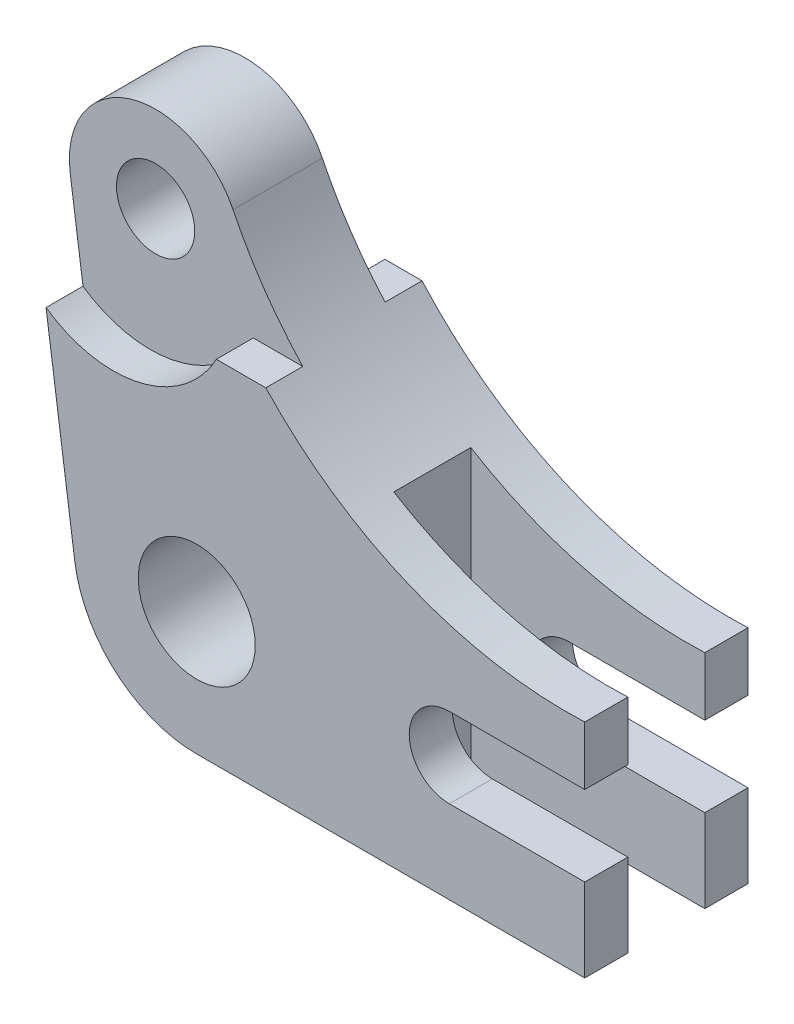
ISO-10303-21;
HEADER;
FILE_DESCRIPTION(('STEP AP214'),'2;1');
FILE_NAME('part.step','',(''),(''),'','','');
FILE_SCHEMA(('AUTOMOTIVE_DESIGN { 1 0 10303 214 1 1 1 1 }'));
ENDSEC;
DATA;
#1=APPLICATION_CONTEXT('core data for automotive mechanical design processes');
#2=APPLICATION_PROTOCOL_DEFINITION('international standard','automotive_design',2000,#1);
#3=PRODUCT_CONTEXT('',#1,'mechanical');
#4=PRODUCT('Part','Part','',(#3));
#5=PRODUCT_RELATED_PRODUCT_CATEGORY('part','',(#4));
#6=PRODUCT_DEFINITION_FORMATION('','',#4);
#7=PRODUCT_DEFINITION_CONTEXT('part definition',#1,'design');
#8=PRODUCT_DEFINITION('design','',#6,#7);
#9=PRODUCT_DEFINITION_SHAPE('','',#8);
#10=(LENGTH_UNIT() NAMED_UNIT(*) SI_UNIT(.MILLI.,.METRE.));
#11=(NAMED_UNIT(*) PLANE_ANGLE_UNIT() SI_UNIT($,.RADIAN.));
#12=(NAMED_UNIT(*) SI_UNIT($,.STERADIAN.) SOLID_ANGLE_UNIT());
#13=UNCERTAINTY_MEASURE_WITH_UNIT(LENGTH_MEASURE(1.E-05),#10,'distance_accuracy_value','');
#14=(GEOMETRIC_REPRESENTATION_CONTEXT(3) GLOBAL_UNCERTAINTY_ASSIGNED_CONTEXT((#13)) GLOBAL_UNIT_ASSIGNED_CONTEXT((#10,
#11,#12)) REPRESENTATION_CONTEXT('',''));
#15=CARTESIAN_POINT('',(0.,0.,0.));
#16=DIRECTION('',(0.,0.,1.));
#17=DIRECTION('',(1.,0.,0.));
#18=AXIS2_PLACEMENT_3D('',#15,#16,#17);
#19=CARTESIAN_POINT('',(-12.6821332100236,47.3303654881643,26.5));
#20=DIRECTION('',(0.,0.,-1.));
#21=DIRECTION('',(-1.,0.,0.));
#22=AXIS2_PLACEMENT_3D('',#19,#20,#21);
#23=CYLINDRICAL_SURFACE('',#22,14.);
#24=CARTESIAN_POINT('',(-12.6821332100236,47.3303654881643,6.));
#25=DIRECTION('',(0.,0.,-1.));
#26=DIRECTION('',(-1.,0.,0.));
#27=AXIS2_PLACEMENT_3D('',#24,#25,#26);
#28=CIRCLE('',#27,14.);
#29=CARTESIAN_POINT('',(-26.5470217071029,45.3900389786416,6.));
#30=VERTEX_POINT('',#29);
#31=CARTESIAN_POINT('',(-0.107256867772479,53.4844279656741,6.));
#32=VERTEX_POINT('',#31);
#33=EDGE_CURVE('E231',#30,#32,#28,.T.);
#34=ORIENTED_EDGE('',*,*,#33,.F.);
#35=DIRECTION('',(0.,0.,-1.));
#36=VECTOR('',#35,1.);
#37=CARTESIAN_POINT('',(-26.5470217071029,45.3900389786416,26.5));
#38=LINE('',#37,#36);
#39=CARTESIAN_POINT('',(-26.5470217071029,45.3900389786416,20.5));
#40=VERTEX_POINT('',#39);
#41=EDGE_CURVE('E386',#40,#30,#38,.T.);
#42=ORIENTED_EDGE('',*,*,#41,.F.);
#43=CARTESIAN_POINT('',(-12.6821332100236,47.3303654881643,20.5));
#44=DIRECTION('',(0.,0.,1.));
#45=DIRECTION('',(1.,0.,0.));
#46=AXIS2_PLACEMENT_3D('',#43,#44,#45);
#47=CIRCLE('',#46,14.);
#48=CARTESIAN_POINT('',(-0.107256867772472,53.4844279656741,20.5));
#49=VERTEX_POINT('',#48);
#50=EDGE_CURVE('E67',#49,#40,#47,.T.);
#51=ORIENTED_EDGE('',*,*,#50,.F.);
#52=DIRECTION('',(0.,0.,-1.));
#53=VECTOR('',#52,1.);
#54=CARTESIAN_POINT('',(-0.107256867772479,53.4844279656741,26.5));
#55=LINE('',#54,#53);
#56=EDGE_CURVE('E330',#49,#32,#55,.T.);
#57=ORIENTED_EDGE('',*,*,#56,.T.);
#58=EDGE_LOOP('',(#34,#42,#51,#57));
#59=FACE_BOUND('',#58,.T.);
#60=ADVANCED_FACE('F45',(#59),#23,.T.);
#61=CARTESIAN_POINT('',(-12.6821332100236,47.3303654881643,26.5));
#62=DIRECTION('',(0.,0.,-1.));
#63=DIRECTION('',(-1.,0.,0.));
#64=AXIS2_PLACEMENT_3D('',#61,#62,#63);
#65=CYLINDRICAL_SURFACE('',#64,6.35);
#66=CARTESIAN_POINT('',(-12.6821332100236,47.3303654881643,20.5));
#67=DIRECTION('',(0.,0.,1.));
#68=DIRECTION('',(1.,0.,0.));
#69=AXIS2_PLACEMENT_3D('',#66,#67,#68);
#70=CIRCLE('',#69,6.35);
#71=CARTESIAN_POINT('',(-6.33213321002356,47.3303654881643,20.5));
#72=VERTEX_POINT('',#71);
#73=EDGE_CURVE('E250',#72,#72,#70,.F.);
#74=ORIENTED_EDGE('',*,*,#73,.F.);
#75=EDGE_LOOP('',(#74));
#76=FACE_BOUND('',#75,.T.);
#77=CARTESIAN_POINT('',(-12.6821332100236,47.3303654881643,6.));
#78=DIRECTION('',(0.,0.,-1.));
#79=DIRECTION('',(-1.,0.,0.));
#80=AXIS2_PLACEMENT_3D('',#77,#78,#79);
#81=CIRCLE('',#80,6.35);
#82=CARTESIAN_POINT('',(-19.0321332100236,47.3303654881643,6.));
#83=VERTEX_POINT('',#82);
#84=EDGE_CURVE('E224',#83,#83,#81,.F.);
#85=ORIENTED_EDGE('',*,*,#84,.F.);
#86=EDGE_LOOP('',(#85));
#87=FACE_BOUND('',#86,.T.);
#88=ADVANCED_FACE('F477',(#76,#87),#65,.F.);
#89=CARTESIAN_POINT('',(60.0725084844293,82.9360126794707,26.5));
#90=DIRECTION('',(0.,0.,-1.));
#91=DIRECTION('',(-1.,0.,0.));
#92=AXIS2_PLACEMENT_3D('',#89,#90,#91);
#93=CYLINDRICAL_SURFACE('',#92,67.);
#94=CARTESIAN_POINT('',(60.0725084844293,82.9360126794707,0.));
#95=DIRECTION('',(0.,0.,-1.));
#96=DIRECTION('',(1.,0.,0.));
#97=AXIS2_PLACEMENT_3D('',#94,#95,#96);
#98=CIRCLE('',#97,67.);
#99=CARTESIAN_POINT('',(63.,16.,0.));
#100=VERTEX_POINT('',#99);
#101=CARTESIAN_POINT('',(10.0791465386199,38.3303654881643,0.));
#102=VERTEX_POINT('',#101);
#103=EDGE_CURVE('E313',#100,#102,#98,.T.);
#104=ORIENTED_EDGE('',*,*,#103,.T.);
#105=DIRECTION('',(0.,0.,-1.));
#106=VECTOR('',#105,1.);
#107=CARTESIAN_POINT('',(10.0791465386199,38.3303654881643,6.));
#108=LINE('',#107,#106);
#109=CARTESIAN_POINT('',(10.0791465386199,38.3303654881643,6.));
#110=VERTEX_POINT('',#109);
#111=EDGE_CURVE('E236',#110,#102,#108,.T.);
#112=ORIENTED_EDGE('',*,*,#111,.F.);
#113=CARTESIAN_POINT('',(60.0725084844293,82.9360126794707,6.));
#114=DIRECTION('',(0.,0.,-1.));
#115=DIRECTION('',(-1.,0.,0.));
#116=AXIS2_PLACEMENT_3D('',#113,#114,#115);
#117=CIRCLE('',#116,67.);
#118=EDGE_CURVE('E211',#32,#110,#117,.F.);
#119=ORIENTED_EDGE('',*,*,#118,.F.);
#120=ORIENTED_EDGE('',*,*,#56,.F.);
#121=CARTESIAN_POINT('',(60.0725084844293,82.9360126794707,20.5));
#122=DIRECTION('',(0.,0.,1.));
#123=DIRECTION('',(1.,0.,0.));
#124=AXIS2_PLACEMENT_3D('',#121,#122,#123);
#125=CIRCLE('',#124,67.);
#126=CARTESIAN_POINT('',(11.2099266448969,37.0944584303508,20.5));
#127=VERTEX_POINT('',#126);
#128=EDGE_CURVE('E245',#127,#49,#125,.F.);
#129=ORIENTED_EDGE('',*,*,#128,.F.);
#130=DIRECTION('',(0.,0.,1.));
#131=VECTOR('',#130,1.);
#132=CARTESIAN_POINT('',(11.2099266448969,37.0944584303508,20.5));
#133=LINE('',#132,#131);
#134=CARTESIAN_POINT('',(11.2099266448969,37.0944584303508,26.5));
#135=VERTEX_POINT('',#134);
#136=EDGE_CURVE('E261',#127,#135,#133,.T.);
#137=ORIENTED_EDGE('',*,*,#136,.T.);
#138=CARTESIAN_POINT('',(60.0725084844293,82.9360126794707,26.5));
#139=DIRECTION('',(0.,0.,-1.));
#140=DIRECTION('',(1.,0.,0.));
#141=AXIS2_PLACEMENT_3D('',#138,#139,#140);
#142=CIRCLE('',#141,67.);
#143=CARTESIAN_POINT('',(63.,16.,26.5));
#144=VERTEX_POINT('',#143);
#145=EDGE_CURVE('E327',#144,#135,#142,.T.);
#146=ORIENTED_EDGE('',*,*,#145,.F.);
#147=DIRECTION('',(0.,0.,-1.));
#148=VECTOR('',#147,1.);
#149=CARTESIAN_POINT('',(63.,16.,26.5));
#150=LINE('',#149,#148);
#151=CARTESIAN_POINT('',(63.,16.,19.5));
#152=VERTEX_POINT('',#151);
#153=EDGE_CURVE('E357',#144,#152,#150,.T.);
#154=ORIENTED_EDGE('',*,*,#153,.T.);
#155=CARTESIAN_POINT('',(60.0725084844293,82.9360126794707,19.5));
#156=DIRECTION('',(0.,0.,-1.));
#157=DIRECTION('',(-1.,0.,0.));
#158=AXIS2_PLACEMENT_3D('',#155,#156,#157);
#159=CIRCLE('',#158,67.);
#160=CARTESIAN_POINT('',(25.,25.8490689128822,19.5));
#161=VERTEX_POINT('',#160);
#162=EDGE_CURVE('E12',#161,#152,#159,.F.);
#163=ORIENTED_EDGE('',*,*,#162,.F.);
#164=DIRECTION('',(0.,0.,-1.));
#165=VECTOR('',#164,1.);
#166=CARTESIAN_POINT('',(25.,25.8490689128822,26.5));
#167=LINE('',#166,#165);
#168=CARTESIAN_POINT('',(25.,25.8490689128822,7.));
#169=VERTEX_POINT('',#168);
#170=EDGE_CURVE('E260',#161,#169,#167,.T.);
#171=ORIENTED_EDGE('',*,*,#170,.T.);
#172=CARTESIAN_POINT('',(60.0725084844293,82.9360126794707,7.));
#173=DIRECTION('',(0.,0.,-1.));
#174=DIRECTION('',(-1.,0.,0.));
#175=AXIS2_PLACEMENT_3D('',#172,#173,#174);
#176=CIRCLE('',#175,67.);
#177=CARTESIAN_POINT('',(63.,16.,7.));
#178=VERTEX_POINT('',#177);
#179=EDGE_CURVE('E52',#169,#178,#176,.F.);
#180=ORIENTED_EDGE('',*,*,#179,.T.);
#181=EDGE_CURVE('E356',#178,#100,#150,.T.);
#182=ORIENTED_EDGE('',*,*,#181,.T.);
#183=EDGE_LOOP('',(#104,#112,#119,#120,#129,#137,#146,#154,#163,#171,#180,#182));
#184=FACE_BOUND('',#183,.T.);
#185=ADVANCED_FACE('F391',(#184),#93,.F.);
#186=CARTESIAN_POINT('',(-12.6821332100236,47.3303654881643,26.5));
#187=DIRECTION('',(0.,0.,1.));
#188=DIRECTION('',(1.,0.,0.));
#189=AXIS2_PLACEMENT_3D('',#186,#187,#188);
#190=PLANE('',#189);
#191=CARTESIAN_POINT('',(0.,0.,26.5));
#192=DIRECTION('',(0.,0.,1.));
#193=DIRECTION('',(1.,0.,0.));
#194=AXIS2_PLACEMENT_3D('',#191,#192,#193);
#195=CIRCLE('',#194,9.5);
#196=CARTESIAN_POINT('',(9.5,0.,26.5));
#197=VERTEX_POINT('',#196);
#198=EDGE_CURVE('E304',#197,#197,#195,.T.);
#199=ORIENTED_EDGE('',*,*,#198,.F.);
#200=EDGE_LOOP('',(#199));
#201=FACE_BOUND('',#200,.T.);
#202=DIRECTION('',(-1.,0.,0.));
#203=VECTOR('',#202,1.);
#204=CARTESIAN_POINT('',(0.,37.0944584303508,26.5));
#205=LINE('',#204,#203);
#206=CARTESIAN_POINT('',(3.18311699616794,37.0944584303508,26.5));
#207=VERTEX_POINT('',#206);
#208=EDGE_CURVE('E243',#135,#207,#205,.T.);
#209=ORIENTED_EDGE('',*,*,#208,.T.);
#210=CARTESIAN_POINT('',(-13.5500835345136,46.0944584303508,26.5));
#211=DIRECTION('',(0.,0.,1.));
#212=DIRECTION('',(1.,0.,0.));
#213=AXIS2_PLACEMENT_3D('',#210,#211,#212);
#214=CIRCLE('',#213,19.);
#215=CARTESIAN_POINT('',(-24.4696271117496,30.5457103114557,26.5));
#216=VERTEX_POINT('',#215);
#217=EDGE_CURVE('E238',#207,#216,#214,.F.);
#218=ORIENTED_EDGE('',*,*,#217,.T.);
#219=DIRECTION('',(0.138594750680193,-0.990349178362811,0.));
#220=VECTOR('',#219,1.);
#221=CARTESIAN_POINT('',(-26.5470217071029,45.3900389786416,26.5));
#222=LINE('',#221,#220);
#223=CARTESIAN_POINT('',(-19.8069835672562,-2.77189501360386,26.5));
#224=VERTEX_POINT('',#223);
#225=EDGE_CURVE('E310',#216,#224,#222,.T.);
#226=ORIENTED_EDGE('',*,*,#225,.T.);
#227=CARTESIAN_POINT('',(0.,0.,26.5));
#228=DIRECTION('',(0.,0.,1.));
#229=DIRECTION('',(1.,0.,0.));
#230=AXIS2_PLACEMENT_3D('',#227,#228,#229);
#231=CIRCLE('',#230,20.);
#232=CARTESIAN_POINT('',(0.,-20.,26.5));
#233=VERTEX_POINT('',#232);
#234=EDGE_CURVE('E312',#224,#233,#231,.T.);
#235=ORIENTED_EDGE('',*,*,#234,.T.);
#236=DIRECTION('',(1.,0.,0.));
#237=VECTOR('',#236,1.);
#238=CARTESIAN_POINT('',(0.,-20.,26.5));
#239=LINE('',#238,#237);
#240=CARTESIAN_POINT('',(63.,-20.,26.5));
#241=VERTEX_POINT('',#240);
#242=EDGE_CURVE('E315',#233,#241,#239,.T.);
#243=ORIENTED_EDGE('',*,*,#242,.T.);
#244=DIRECTION('',(0.,1.,0.));
#245=VECTOR('',#244,1.);
#246=CARTESIAN_POINT('',(63.,-20.,26.5));
#247=LINE('',#246,#245);
#248=CARTESIAN_POINT('',(63.,-6.5,26.5));
#249=VERTEX_POINT('',#248);
#250=EDGE_CURVE('E317',#241,#249,#247,.T.);
#251=ORIENTED_EDGE('',*,*,#250,.T.);
#252=DIRECTION('',(-1.,0.,0.));
#253=VECTOR('',#252,1.);
#254=CARTESIAN_POINT('',(63.,-6.5,26.5));
#255=LINE('',#254,#253);
#256=CARTESIAN_POINT('',(41.,-6.5,26.5));
#257=VERTEX_POINT('',#256);
#258=EDGE_CURVE('E319',#249,#257,#255,.T.);
#259=ORIENTED_EDGE('',*,*,#258,.T.);
#260=CARTESIAN_POINT('',(41.,0.,26.5));
#261=DIRECTION('',(0.,0.,-1.));
#262=DIRECTION('',(1.,0.,0.));
#263=AXIS2_PLACEMENT_3D('',#260,#261,#262);
#264=CIRCLE('',#263,6.5);
#265=CARTESIAN_POINT('',(41.,6.5,26.5));
#266=VERTEX_POINT('',#265);
#267=EDGE_CURVE('E321',#257,#266,#264,.T.);
#268=ORIENTED_EDGE('',*,*,#267,.T.);
#269=DIRECTION('',(1.,0.,0.));
#270=VECTOR('',#269,1.);
#271=CARTESIAN_POINT('',(63.,6.5,26.5));
#272=LINE('',#271,#270);
#273=CARTESIAN_POINT('',(63.,6.5,26.5));
#274=VERTEX_POINT('',#273);
#275=EDGE_CURVE('E323',#266,#274,#272,.T.);
#276=ORIENTED_EDGE('',*,*,#275,.T.);
#277=DIRECTION('',(0.,1.,0.));
#278=VECTOR('',#277,1.);
#279=CARTESIAN_POINT('',(63.,16.,26.5));
#280=LINE('',#279,#278);
#281=EDGE_CURVE('E325',#274,#144,#280,.T.);
#282=ORIENTED_EDGE('',*,*,#281,.T.);
#283=ORIENTED_EDGE('',*,*,#145,.T.);
#284=EDGE_LOOP('',(#209,#218,#226,#235,#243,#251,#259,#268,#276,#282,#283));
#285=FACE_BOUND('',#284,.T.);
#286=ADVANCED_FACE('F425',(#201,#285),#190,.T.);
#287=CARTESIAN_POINT('',(-26.5470217071029,45.3900389786416,26.5));
#288=DIRECTION('',(0.990349178362811,0.138594750680193,0.));
#289=DIRECTION('',(-0.138594750680193,0.990349178362811,0.));
#290=AXIS2_PLACEMENT_3D('',#287,#288,#289);
#291=PLANE('',#290);
#292=DIRECTION('',(-0.138594750680193,0.990349178362811,0.));
#293=VECTOR('',#292,1.);
#294=CARTESIAN_POINT('',(-19.8069835672562,-2.77189501360386,6.));
#295=LINE('',#294,#293);
#296=CARTESIAN_POINT('',(-24.7667399004337,32.6687734484814,6.));
#297=VERTEX_POINT('',#296);
#298=EDGE_CURVE('E219',#297,#30,#295,.T.);
#299=ORIENTED_EDGE('',*,*,#298,.F.);
#300=DIRECTION('',(0.,0.,-1.));
#301=VECTOR('',#300,1.);
#302=CARTESIAN_POINT('',(-24.7667399004337,32.6687734484814,6.));
#303=LINE('',#302,#301);
#304=CARTESIAN_POINT('',(-24.7667399004337,32.6687734484814,0.));
#305=VERTEX_POINT('',#304);
#306=EDGE_CURVE('E210',#297,#305,#303,.T.);
#307=ORIENTED_EDGE('',*,*,#306,.T.);
#308=DIRECTION('',(0.138594750680193,-0.990349178362811,0.));
#309=VECTOR('',#308,1.);
#310=CARTESIAN_POINT('',(-26.5470217071029,45.3900389786416,0.));
#311=LINE('',#310,#309);
#312=CARTESIAN_POINT('',(-19.8069835672562,-2.77189501360386,0.));
#313=VERTEX_POINT('',#312);
#314=EDGE_CURVE('E307',#305,#313,#311,.T.);
#315=ORIENTED_EDGE('',*,*,#314,.T.);
#316=DIRECTION('',(0.,0.,-1.));
#317=VECTOR('',#316,1.);
#318=CARTESIAN_POINT('',(-19.8069835672562,-2.77189501360386,26.5));
#319=LINE('',#318,#317);
#320=EDGE_CURVE('E383',#224,#313,#319,.T.);
#321=ORIENTED_EDGE('',*,*,#320,.F.);
#322=ORIENTED_EDGE('',*,*,#225,.F.);
#323=DIRECTION('',(0.,0.,1.));
#324=VECTOR('',#323,1.);
#325=CARTESIAN_POINT('',(-24.4696271117496,30.5457103114557,20.5));
#326=LINE('',#325,#324);
#327=CARTESIAN_POINT('',(-24.4696271117496,30.5457103114557,20.5));
#328=VERTEX_POINT('',#327);
#329=EDGE_CURVE('E258',#328,#216,#326,.T.);
#330=ORIENTED_EDGE('',*,*,#329,.F.);
#331=DIRECTION('',(0.138594750680193,-0.990349178362811,0.));
#332=VECTOR('',#331,1.);
#333=CARTESIAN_POINT('',(-19.8069835672562,-2.77189501360386,20.5));
#334=LINE('',#333,#332);
#335=EDGE_CURVE('E248',#40,#328,#334,.T.);
#336=ORIENTED_EDGE('',*,*,#335,.F.);
#337=ORIENTED_EDGE('',*,*,#41,.T.);
#338=EDGE_LOOP('',(#299,#307,#315,#321,#322,#330,#336,#337));
#339=FACE_BOUND('',#338,.T.);
#340=ADVANCED_FACE('F410',(#339),#291,.F.);
#341=CARTESIAN_POINT('',(0.,-20.,26.5));
#342=DIRECTION('',(0.,1.,0.));
#343=DIRECTION('',(-1.,0.,0.));
#344=AXIS2_PLACEMENT_3D('',#341,#342,#343);
#345=PLANE('',#344);
#346=DIRECTION('',(1.,0.,0.));
#347=VECTOR('',#346,1.);
#348=CARTESIAN_POINT('',(25.,-20.,19.5));
#349=LINE('',#348,#347);
#350=CARTESIAN_POINT('',(25.,-20.,19.5));
#351=VERTEX_POINT('',#350);
#352=CARTESIAN_POINT('',(63.,-20.,19.5));
#353=VERTEX_POINT('',#352);
#354=EDGE_CURVE('E278',#351,#353,#349,.T.);
#355=ORIENTED_EDGE('',*,*,#354,.T.);
#356=DIRECTION('',(0.,0.,-1.));
#357=VECTOR('',#356,1.);
#358=CARTESIAN_POINT('',(63.,-20.,26.5));
#359=LINE('',#358,#357);
#360=EDGE_CURVE('E377',#241,#353,#359,.T.);
#361=ORIENTED_EDGE('',*,*,#360,.F.);
#362=ORIENTED_EDGE('',*,*,#242,.F.);
#363=DIRECTION('',(0.,0.,-1.));
#364=VECTOR('',#363,1.);
#365=CARTESIAN_POINT('',(0.,-20.,26.5));
#366=LINE('',#365,#364);
#367=CARTESIAN_POINT('',(0.,-20.,0.));
#368=VERTEX_POINT('',#367);
#369=EDGE_CURVE('E380',#233,#368,#366,.T.);
#370=ORIENTED_EDGE('',*,*,#369,.T.);
#371=DIRECTION('',(1.,0.,0.));
#372=VECTOR('',#371,1.);
#373=CARTESIAN_POINT('',(0.,-20.,0.));
#374=LINE('',#373,#372);
#375=CARTESIAN_POINT('',(63.,-20.,0.));
#376=VERTEX_POINT('',#375);
#377=EDGE_CURVE('E334',#368,#376,#374,.T.);
#378=ORIENTED_EDGE('',*,*,#377,.T.);
#379=CARTESIAN_POINT('',(63.,-20.,7.));
#380=VERTEX_POINT('',#379);
#381=EDGE_CURVE('E376',#380,#376,#359,.T.);
#382=ORIENTED_EDGE('',*,*,#381,.F.);
#383=DIRECTION('',(1.,0.,0.));
#384=VECTOR('',#383,1.);
#385=CARTESIAN_POINT('',(25.,-20.,7.));
#386=LINE('',#385,#384);
#387=CARTESIAN_POINT('',(25.,-20.,7.));
#388=VERTEX_POINT('',#387);
#389=EDGE_CURVE('E284',#388,#380,#386,.T.);
#390=ORIENTED_EDGE('',*,*,#389,.F.);
#391=DIRECTION('',(0.,0.,-1.));
#392=VECTOR('',#391,1.);
#393=CARTESIAN_POINT('',(25.,-20.,0.));
#394=LINE('',#393,#392);
#395=EDGE_CURVE('E271',#351,#388,#394,.T.);
#396=ORIENTED_EDGE('',*,*,#395,.F.);
#397=EDGE_LOOP('',(#355,#361,#362,#370,#378,#382,#390,#396));
#398=FACE_BOUND('',#397,.T.);
#399=ADVANCED_FACE('F447',(#398),#345,.F.);
#400=CARTESIAN_POINT('',(63.,-20.,26.5));
#401=DIRECTION('',(-1.,0.,0.));
#402=DIRECTION('',(0.,0.,1.));
#403=AXIS2_PLACEMENT_3D('',#400,#401,#402);
#404=PLANE('',#403);
#405=DIRECTION('',(0.,1.,0.));
#406=VECTOR('',#405,1.);
#407=CARTESIAN_POINT('',(63.,0.,19.5));
#408=LINE('',#407,#406);
#409=CARTESIAN_POINT('',(63.,-6.5,19.5));
#410=VERTEX_POINT('',#409);
#411=EDGE_CURVE('E279',#353,#410,#408,.T.);
#412=ORIENTED_EDGE('',*,*,#411,.T.);
#413=DIRECTION('',(0.,0.,-1.));
#414=VECTOR('',#413,1.);
#415=CARTESIAN_POINT('',(63.,-6.5,26.5));
#416=LINE('',#415,#414);
#417=EDGE_CURVE('E373',#249,#410,#416,.T.);
#418=ORIENTED_EDGE('',*,*,#417,.F.);
#419=ORIENTED_EDGE('',*,*,#250,.F.);
#420=ORIENTED_EDGE('',*,*,#360,.T.);
#421=EDGE_LOOP('',(#412,#418,#419,#420));
#422=FACE_BOUND('',#421,.T.);
#423=ADVANCED_FACE('F525',(#422),#404,.F.);
#424=CARTESIAN_POINT('',(63.,-6.5,26.5));
#425=DIRECTION('',(0.,-1.,0.));
#426=DIRECTION('',(1.,0.,0.));
#427=AXIS2_PLACEMENT_3D('',#424,#425,#426);
#428=PLANE('',#427);
#429=DIRECTION('',(1.,0.,0.));
#430=VECTOR('',#429,1.);
#431=CARTESIAN_POINT('',(63.,-6.5,19.5));
#432=LINE('',#431,#430);
#433=CARTESIAN_POINT('',(41.,-6.5,19.5));
#434=VERTEX_POINT('',#433);
#435=EDGE_CURVE('E301',#434,#410,#432,.T.);
#436=ORIENTED_EDGE('',*,*,#435,.F.);
#437=DIRECTION('',(0.,0.,-1.));
#438=VECTOR('',#437,1.);
#439=CARTESIAN_POINT('',(41.,-6.5,26.5));
#440=LINE('',#439,#438);
#441=EDGE_CURVE('E369',#257,#434,#440,.T.);
#442=ORIENTED_EDGE('',*,*,#441,.F.);
#443=ORIENTED_EDGE('',*,*,#258,.F.);
#444=ORIENTED_EDGE('',*,*,#417,.T.);
#445=EDGE_LOOP('',(#436,#442,#443,#444));
#446=FACE_BOUND('',#445,.T.);
#447=ADVANCED_FACE('F518',(#446),#428,.F.);
#448=CARTESIAN_POINT('',(41.,0.,26.5));
#449=DIRECTION('',(0.,0.,-1.));
#450=DIRECTION('',(-1.,0.,0.));
#451=AXIS2_PLACEMENT_3D('',#448,#449,#450);
#452=CYLINDRICAL_SURFACE('',#451,6.5);
#453=CARTESIAN_POINT('',(41.,0.,19.5));
#454=DIRECTION('',(0.,0.,-1.));
#455=DIRECTION('',(-1.,0.,0.));
#456=AXIS2_PLACEMENT_3D('',#453,#454,#455);
#457=CIRCLE('',#456,6.5);
#458=CARTESIAN_POINT('',(41.,6.5,19.5));
#459=VERTEX_POINT('',#458);
#460=EDGE_CURVE('E299',#459,#434,#457,.F.);
#461=ORIENTED_EDGE('',*,*,#460,.F.);
#462=DIRECTION('',(0.,0.,-1.));
#463=VECTOR('',#462,1.);
#464=CARTESIAN_POINT('',(41.,6.5,26.5));
#465=LINE('',#464,#463);
#466=EDGE_CURVE('E365',#266,#459,#465,.T.);
#467=ORIENTED_EDGE('',*,*,#466,.F.);
#468=ORIENTED_EDGE('',*,*,#267,.F.);
#469=ORIENTED_EDGE('',*,*,#441,.T.);
#470=EDGE_LOOP('',(#461,#467,#468,#469));
#471=FACE_BOUND('',#470,.T.);
#472=ADVANCED_FACE('F473',(#471),#452,.F.);
#473=CARTESIAN_POINT('',(63.,6.5,26.5));
#474=DIRECTION('',(0.,1.,0.));
#475=DIRECTION('',(-1.,0.,0.));
#476=AXIS2_PLACEMENT_3D('',#473,#474,#475);
#477=PLANE('',#476);
#478=DIRECTION('',(-1.,0.,0.));
#479=VECTOR('',#478,1.);
#480=CARTESIAN_POINT('',(63.,6.5,19.5));
#481=LINE('',#480,#479);
#482=CARTESIAN_POINT('',(63.,6.5,19.5));
#483=VERTEX_POINT('',#482);
#484=EDGE_CURVE('E297',#483,#459,#481,.T.);
#485=ORIENTED_EDGE('',*,*,#484,.F.);
#486=DIRECTION('',(0.,0.,-1.));
#487=VECTOR('',#486,1.);
#488=CARTESIAN_POINT('',(63.,6.5,26.5));
#489=LINE('',#488,#487);
#490=EDGE_CURVE('E361',#274,#483,#489,.T.);
#491=ORIENTED_EDGE('',*,*,#490,.F.);
#492=ORIENTED_EDGE('',*,*,#275,.F.);
#493=ORIENTED_EDGE('',*,*,#466,.T.);
#494=EDGE_LOOP('',(#485,#491,#492,#493));
#495=FACE_BOUND('',#494,.T.);
#496=ADVANCED_FACE('F465',(#495),#477,.F.);
#497=CARTESIAN_POINT('',(63.,16.,26.5));
#498=DIRECTION('',(-1.,0.,0.));
#499=DIRECTION('',(0.,0.,1.));
#500=AXIS2_PLACEMENT_3D('',#497,#498,#499);
#501=PLANE('',#500);
#502=EDGE_CURVE('E267',#483,#152,#408,.T.);
#503=ORIENTED_EDGE('',*,*,#502,.T.);
#504=ORIENTED_EDGE('',*,*,#153,.F.);
#505=ORIENTED_EDGE('',*,*,#281,.F.);
#506=ORIENTED_EDGE('',*,*,#490,.T.);
#507=EDGE_LOOP('',(#503,#504,#505,#506));
#508=FACE_BOUND('',#507,.T.);
#509=ADVANCED_FACE('F432',(#508),#501,.F.);
#510=CARTESIAN_POINT('',(-12.6821332100236,47.3303654881643,0.));
#511=DIRECTION('',(0.,0.,1.));
#512=DIRECTION('',(1.,0.,0.));
#513=AXIS2_PLACEMENT_3D('',#510,#511,#512);
#514=PLANE('',#513);
#515=CARTESIAN_POINT('',(-12.6821332100236,47.3303654881643,0.));
#516=DIRECTION('',(0.,0.,-1.));
#517=DIRECTION('',(-1.,0.,0.));
#518=AXIS2_PLACEMENT_3D('',#515,#516,#517);
#519=CIRCLE('',#518,19.);
#520=CARTESIAN_POINT('',(4.05106732065795,38.3303654881643,0.));
#521=VERTEX_POINT('',#520);
#522=EDGE_CURVE('E227',#521,#305,#519,.T.);
#523=ORIENTED_EDGE('',*,*,#522,.F.);
#524=DIRECTION('',(-1.,0.,0.));
#525=VECTOR('',#524,1.);
#526=CARTESIAN_POINT('',(0.,38.3303654881643,0.));
#527=LINE('',#526,#525);
#528=EDGE_CURVE('E59',#102,#521,#527,.T.);
#529=ORIENTED_EDGE('',*,*,#528,.F.);
#530=ORIENTED_EDGE('',*,*,#103,.F.);
#531=DIRECTION('',(0.,1.,0.));
#532=VECTOR('',#531,1.);
#533=CARTESIAN_POINT('',(63.,16.,0.));
#534=LINE('',#533,#532);
#535=CARTESIAN_POINT('',(63.,6.5,0.));
#536=VERTEX_POINT('',#535);
#537=EDGE_CURVE('E349',#536,#100,#534,.T.);
#538=ORIENTED_EDGE('',*,*,#537,.F.);
#539=DIRECTION('',(1.,0.,0.));
#540=VECTOR('',#539,1.);
#541=CARTESIAN_POINT('',(63.,6.5,0.));
#542=LINE('',#541,#540);
#543=CARTESIAN_POINT('',(41.,6.5,0.));
#544=VERTEX_POINT('',#543);
#545=EDGE_CURVE('E346',#544,#536,#542,.T.);
#546=ORIENTED_EDGE('',*,*,#545,.F.);
#547=CARTESIAN_POINT('',(41.,0.,0.));
#548=DIRECTION('',(0.,0.,-1.));
#549=DIRECTION('',(1.,0.,0.));
#550=AXIS2_PLACEMENT_3D('',#547,#548,#549);
#551=CIRCLE('',#550,6.5);
#552=CARTESIAN_POINT('',(41.,-6.5,0.));
#553=VERTEX_POINT('',#552);
#554=EDGE_CURVE('E343',#553,#544,#551,.T.);
#555=ORIENTED_EDGE('',*,*,#554,.F.);
#556=DIRECTION('',(-1.,0.,0.));
#557=VECTOR('',#556,1.);
#558=CARTESIAN_POINT('',(63.,-6.5,0.));
#559=LINE('',#558,#557);
#560=CARTESIAN_POINT('',(63.,-6.5,0.));
#561=VERTEX_POINT('',#560);
#562=EDGE_CURVE('E340',#561,#553,#559,.T.);
#563=ORIENTED_EDGE('',*,*,#562,.F.);
#564=DIRECTION('',(0.,1.,0.));
#565=VECTOR('',#564,1.);
#566=CARTESIAN_POINT('',(63.,-20.,0.));
#567=LINE('',#566,#565);
#568=EDGE_CURVE('E337',#376,#561,#567,.T.);
#569=ORIENTED_EDGE('',*,*,#568,.F.);
#570=ORIENTED_EDGE('',*,*,#377,.F.);
#571=CARTESIAN_POINT('',(0.,0.,0.));
#572=DIRECTION('',(0.,0.,1.));
#573=DIRECTION('',(1.,0.,0.));
#574=AXIS2_PLACEMENT_3D('',#571,#572,#573);
#575=CIRCLE('',#574,20.);
#576=EDGE_CURVE('E332',#313,#368,#575,.T.);
#577=ORIENTED_EDGE('',*,*,#576,.F.);
#578=ORIENTED_EDGE('',*,*,#314,.F.);
#579=EDGE_LOOP('',(#523,#529,#530,#538,#546,#555,#563,#569,#570,#577,#578));
#580=FACE_BOUND('',#579,.T.);
#581=CARTESIAN_POINT('',(0.,0.,0.));
#582=DIRECTION('',(0.,0.,1.));
#583=DIRECTION('',(1.,0.,0.));
#584=AXIS2_PLACEMENT_3D('',#581,#582,#583);
#585=CIRCLE('',#584,9.5);
#586=CARTESIAN_POINT('',(9.5,0.,0.));
#587=VERTEX_POINT('',#586);
#588=EDGE_CURVE('E303',#587,#587,#585,.T.);
#589=ORIENTED_EDGE('',*,*,#588,.T.);
#590=EDGE_LOOP('',(#589));
#591=FACE_BOUND('',#590,.T.);
#592=ADVANCED_FACE('F402',(#580,#591),#514,.F.);
#593=CARTESIAN_POINT('',(0.,0.,26.5));
#594=DIRECTION('',(0.,0.,-1.));
#595=DIRECTION('',(-1.,0.,0.));
#596=AXIS2_PLACEMENT_3D('',#593,#594,#595);
#597=CYLINDRICAL_SURFACE('',#596,20.);
#598=ORIENTED_EDGE('',*,*,#576,.T.);
#599=ORIENTED_EDGE('',*,*,#369,.F.);
#600=ORIENTED_EDGE('',*,*,#234,.F.);
#601=ORIENTED_EDGE('',*,*,#320,.T.);
#602=EDGE_LOOP('',(#598,#599,#600,#601));
#603=FACE_BOUND('',#602,.T.);
#604=ADVANCED_FACE('F499',(#603),#597,.T.);
#605=CARTESIAN_POINT('',(63.,-6.5,7.));
#606=VERTEX_POINT('',#605);
#607=EDGE_CURVE('E372',#606,#561,#416,.T.);
#608=ORIENTED_EDGE('',*,*,#607,.F.);
#609=DIRECTION('',(0.,1.,0.));
#610=VECTOR('',#609,1.);
#611=CARTESIAN_POINT('',(63.,0.,7.));
#612=LINE('',#611,#610);
#613=EDGE_CURVE('E272',#380,#606,#612,.T.);
#614=ORIENTED_EDGE('',*,*,#613,.F.);
#615=ORIENTED_EDGE('',*,*,#381,.T.);
#616=ORIENTED_EDGE('',*,*,#568,.T.);
#617=EDGE_LOOP('',(#608,#614,#615,#616));
#618=FACE_BOUND('',#617,.T.);
#619=ADVANCED_FACE('F446',(#618),#404,.F.);
#620=CARTESIAN_POINT('',(41.,-6.5,7.));
#621=VERTEX_POINT('',#620);
#622=EDGE_CURVE('E368',#621,#553,#440,.T.);
#623=ORIENTED_EDGE('',*,*,#622,.F.);
#624=DIRECTION('',(1.,0.,0.));
#625=VECTOR('',#624,1.);
#626=CARTESIAN_POINT('',(63.,-6.5,7.));
#627=LINE('',#626,#625);
#628=EDGE_CURVE('E294',#621,#606,#627,.T.);
#629=ORIENTED_EDGE('',*,*,#628,.T.);
#630=ORIENTED_EDGE('',*,*,#607,.T.);
#631=ORIENTED_EDGE('',*,*,#562,.T.);
#632=EDGE_LOOP('',(#623,#629,#630,#631));
#633=FACE_BOUND('',#632,.T.);
#634=ADVANCED_FACE('F457',(#633),#428,.F.);
#635=CARTESIAN_POINT('',(41.,6.5,7.));
#636=VERTEX_POINT('',#635);
#637=EDGE_CURVE('E364',#636,#544,#465,.T.);
#638=ORIENTED_EDGE('',*,*,#637,.F.);
#639=CARTESIAN_POINT('',(41.,0.,7.));
#640=DIRECTION('',(0.,0.,-1.));
#641=DIRECTION('',(-1.,0.,0.));
#642=AXIS2_PLACEMENT_3D('',#639,#640,#641);
#643=CIRCLE('',#642,6.5);
#644=EDGE_CURVE('E291',#636,#621,#643,.F.);
#645=ORIENTED_EDGE('',*,*,#644,.T.);
#646=ORIENTED_EDGE('',*,*,#622,.T.);
#647=ORIENTED_EDGE('',*,*,#554,.T.);
#648=EDGE_LOOP('',(#638,#645,#646,#647));
#649=FACE_BOUND('',#648,.T.);
#650=ADVANCED_FACE('F460',(#649),#452,.F.);
#651=CARTESIAN_POINT('',(63.,6.5,7.));
#652=VERTEX_POINT('',#651);
#653=EDGE_CURVE('E360',#652,#536,#489,.T.);
#654=ORIENTED_EDGE('',*,*,#653,.F.);
#655=DIRECTION('',(-1.,0.,0.));
#656=VECTOR('',#655,1.);
#657=CARTESIAN_POINT('',(63.,6.5,7.));
#658=LINE('',#657,#656);
#659=EDGE_CURVE('E286',#652,#636,#658,.T.);
#660=ORIENTED_EDGE('',*,*,#659,.T.);
#661=ORIENTED_EDGE('',*,*,#637,.T.);
#662=ORIENTED_EDGE('',*,*,#545,.T.);
#663=EDGE_LOOP('',(#654,#660,#661,#662));
#664=FACE_BOUND('',#663,.T.);
#665=ADVANCED_FACE('F462',(#664),#477,.F.);
#666=ORIENTED_EDGE('',*,*,#181,.F.);
#667=EDGE_CURVE('E282',#652,#178,#612,.T.);
#668=ORIENTED_EDGE('',*,*,#667,.F.);
#669=ORIENTED_EDGE('',*,*,#653,.T.);
#670=ORIENTED_EDGE('',*,*,#537,.T.);
#671=EDGE_LOOP('',(#666,#668,#669,#670));
#672=FACE_BOUND('',#671,.T.);
#673=ADVANCED_FACE('F396',(#672),#501,.F.);
#674=CARTESIAN_POINT('',(0.,0.,26.5));
#675=DIRECTION('',(0.,0.,-1.));
#676=DIRECTION('',(-1.,0.,0.));
#677=AXIS2_PLACEMENT_3D('',#674,#675,#676);
#678=CYLINDRICAL_SURFACE('',#677,9.5);
#679=ORIENTED_EDGE('',*,*,#198,.T.);
#680=EDGE_LOOP('',(#679));
#681=FACE_BOUND('',#680,.T.);
#682=ORIENTED_EDGE('',*,*,#588,.F.);
#683=EDGE_LOOP('',(#682));
#684=FACE_BOUND('',#683,.T.);
#685=ADVANCED_FACE('F470',(#681,#684),#678,.F.);
#686=CARTESIAN_POINT('',(25.,0.,19.5));
#687=DIRECTION('',(0.,0.,-1.));
#688=DIRECTION('',(-1.,0.,0.));
#689=AXIS2_PLACEMENT_3D('',#686,#687,#688);
#690=PLANE('',#689);
#691=ORIENTED_EDGE('',*,*,#435,.T.);
#692=ORIENTED_EDGE('',*,*,#411,.F.);
#693=ORIENTED_EDGE('',*,*,#354,.F.);
#694=DIRECTION('',(0.,1.,0.));
#695=VECTOR('',#694,1.);
#696=CARTESIAN_POINT('',(25.,0.,19.5));
#697=LINE('',#696,#695);
#698=EDGE_CURVE('E268',#351,#161,#697,.T.);
#699=ORIENTED_EDGE('',*,*,#698,.T.);
#700=ORIENTED_EDGE('',*,*,#162,.T.);
#701=ORIENTED_EDGE('',*,*,#502,.F.);
#702=ORIENTED_EDGE('',*,*,#484,.T.);
#703=ORIENTED_EDGE('',*,*,#460,.T.);
#704=EDGE_LOOP('',(#691,#692,#693,#699,#700,#701,#702,#703));
#705=FACE_BOUND('',#704,.T.);
#706=ADVANCED_FACE('F435',(#705),#690,.T.);
#707=CARTESIAN_POINT('',(25.,0.,7.));
#708=DIRECTION('',(0.,0.,-1.));
#709=DIRECTION('',(-1.,0.,0.));
#710=AXIS2_PLACEMENT_3D('',#707,#708,#709);
#711=PLANE('',#710);
#712=ORIENTED_EDGE('',*,*,#644,.F.);
#713=ORIENTED_EDGE('',*,*,#659,.F.);
#714=ORIENTED_EDGE('',*,*,#667,.T.);
#715=ORIENTED_EDGE('',*,*,#179,.F.);
#716=DIRECTION('',(0.,1.,0.));
#717=VECTOR('',#716,1.);
#718=CARTESIAN_POINT('',(25.,0.,7.));
#719=LINE('',#718,#717);
#720=EDGE_CURVE('E275',#388,#169,#719,.T.);
#721=ORIENTED_EDGE('',*,*,#720,.F.);
#722=ORIENTED_EDGE('',*,*,#389,.T.);
#723=ORIENTED_EDGE('',*,*,#613,.T.);
#724=ORIENTED_EDGE('',*,*,#628,.F.);
#725=EDGE_LOOP('',(#712,#713,#714,#715,#721,#722,#723,#724));
#726=FACE_BOUND('',#725,.T.);
#727=ADVANCED_FACE('F440',(#726),#711,.F.);
#728=CARTESIAN_POINT('',(25.,0.,0.));
#729=DIRECTION('',(1.,0.,0.));
#730=DIRECTION('',(0.,0.,-1.));
#731=AXIS2_PLACEMENT_3D('',#728,#729,#730);
#732=PLANE('',#731);
#733=ORIENTED_EDGE('',*,*,#698,.F.);
#734=ORIENTED_EDGE('',*,*,#395,.T.);
#735=ORIENTED_EDGE('',*,*,#720,.T.);
#736=ORIENTED_EDGE('',*,*,#170,.F.);
#737=EDGE_LOOP('',(#733,#734,#735,#736));
#738=FACE_BOUND('',#737,.T.);
#739=ADVANCED_FACE('F438',(#738),#732,.T.);
#740=CARTESIAN_POINT('',(-13.5500835345136,46.0944584303508,20.5));
#741=DIRECTION('',(0.,0.,1.));
#742=DIRECTION('',(1.,0.,0.));
#743=AXIS2_PLACEMENT_3D('',#740,#741,#742);
#744=CYLINDRICAL_SURFACE('',#743,19.);
#745=ORIENTED_EDGE('',*,*,#217,.F.);
#746=DIRECTION('',(0.,0.,1.));
#747=VECTOR('',#746,1.);
#748=CARTESIAN_POINT('',(3.18311699616794,37.0944584303508,20.5));
#749=LINE('',#748,#747);
#750=CARTESIAN_POINT('',(3.18311699616794,37.0944584303508,20.5));
#751=VERTEX_POINT('',#750);
#752=EDGE_CURVE('E253',#751,#207,#749,.T.);
#753=ORIENTED_EDGE('',*,*,#752,.F.);
#754=CARTESIAN_POINT('',(-13.5500835345136,46.0944584303508,20.5));
#755=DIRECTION('',(0.,0.,1.));
#756=DIRECTION('',(1.,0.,0.));
#757=AXIS2_PLACEMENT_3D('',#754,#755,#756);
#758=CIRCLE('',#757,19.);
#759=EDGE_CURVE('E240',#751,#328,#758,.F.);
#760=ORIENTED_EDGE('',*,*,#759,.T.);
#761=ORIENTED_EDGE('',*,*,#329,.T.);
#762=EDGE_LOOP('',(#745,#753,#760,#761));
#763=FACE_BOUND('',#762,.T.);
#764=ADVANCED_FACE('F420',(#763),#744,.F.);
#765=CARTESIAN_POINT('',(0.,37.0944584303508,20.5));
#766=DIRECTION('',(0.,1.,0.));
#767=DIRECTION('',(0.,0.,1.));
#768=AXIS2_PLACEMENT_3D('',#765,#766,#767);
#769=PLANE('',#768);
#770=ORIENTED_EDGE('',*,*,#208,.F.);
#771=ORIENTED_EDGE('',*,*,#136,.F.);
#772=DIRECTION('',(-1.,0.,0.));
#773=VECTOR('',#772,1.);
#774=CARTESIAN_POINT('',(0.,37.0944584303508,20.5));
#775=LINE('',#774,#773);
#776=EDGE_CURVE('E242',#127,#751,#775,.T.);
#777=ORIENTED_EDGE('',*,*,#776,.T.);
#778=ORIENTED_EDGE('',*,*,#752,.T.);
#779=EDGE_LOOP('',(#770,#771,#777,#778));
#780=FACE_BOUND('',#779,.T.);
#781=ADVANCED_FACE('F422',(#780),#769,.T.);
#782=CARTESIAN_POINT('',(0.,0.,20.5));
#783=DIRECTION('',(0.,0.,1.));
#784=DIRECTION('',(1.,0.,0.));
#785=AXIS2_PLACEMENT_3D('',#782,#783,#784);
#786=PLANE('',#785);
#787=ORIENTED_EDGE('',*,*,#759,.F.);
#788=ORIENTED_EDGE('',*,*,#776,.F.);
#789=ORIENTED_EDGE('',*,*,#128,.T.);
#790=ORIENTED_EDGE('',*,*,#50,.T.);
#791=ORIENTED_EDGE('',*,*,#335,.T.);
#792=EDGE_LOOP('',(#787,#788,#789,#790,#791));
#793=FACE_BOUND('',#792,.T.);
#794=ORIENTED_EDGE('',*,*,#73,.T.);
#795=EDGE_LOOP('',(#794));
#796=FACE_BOUND('',#795,.T.);
#797=ADVANCED_FACE('F414',(#793,#796),#786,.T.);
#798=CARTESIAN_POINT('',(0.,38.3303654881643,6.));
#799=DIRECTION('',(0.,-1.,0.));
#800=DIRECTION('',(0.,0.,-1.));
#801=AXIS2_PLACEMENT_3D('',#798,#799,#800);
#802=PLANE('',#801);
#803=ORIENTED_EDGE('',*,*,#528,.T.);
#804=DIRECTION('',(0.,0.,-1.));
#805=VECTOR('',#804,1.);
#806=CARTESIAN_POINT('',(4.05106732065795,38.3303654881643,6.));
#807=LINE('',#806,#805);
#808=CARTESIAN_POINT('',(4.05106732065795,38.3303654881643,6.));
#809=VERTEX_POINT('',#808);
#810=EDGE_CURVE('E202',#809,#521,#807,.T.);
#811=ORIENTED_EDGE('',*,*,#810,.F.);
#812=DIRECTION('',(-1.,0.,0.));
#813=VECTOR('',#812,1.);
#814=CARTESIAN_POINT('',(0.,38.3303654881643,6.));
#815=LINE('',#814,#813);
#816=EDGE_CURVE('E206',#110,#809,#815,.T.);
#817=ORIENTED_EDGE('',*,*,#816,.F.);
#818=ORIENTED_EDGE('',*,*,#111,.T.);
#819=EDGE_LOOP('',(#803,#811,#817,#818));
#820=FACE_BOUND('',#819,.T.);
#821=ADVANCED_FACE('F204',(#820),#802,.F.);
#822=CARTESIAN_POINT('',(-12.6821332100236,47.3303654881643,6.));
#823=DIRECTION('',(0.,0.,-1.));
#824=DIRECTION('',(-1.,0.,0.));
#825=AXIS2_PLACEMENT_3D('',#822,#823,#824);
#826=CYLINDRICAL_SURFACE('',#825,19.);
#827=ORIENTED_EDGE('',*,*,#522,.T.);
#828=ORIENTED_EDGE('',*,*,#306,.F.);
#829=CARTESIAN_POINT('',(-12.6821332100236,47.3303654881643,6.));
#830=DIRECTION('',(0.,0.,-1.));
#831=DIRECTION('',(-1.,0.,0.));
#832=AXIS2_PLACEMENT_3D('',#829,#830,#831);
#833=CIRCLE('',#832,19.);
#834=EDGE_CURVE('E214',#809,#297,#833,.T.);
#835=ORIENTED_EDGE('',*,*,#834,.F.);
#836=ORIENTED_EDGE('',*,*,#810,.T.);
#837=EDGE_LOOP('',(#827,#828,#835,#836));
#838=FACE_BOUND('',#837,.T.);
#839=ADVANCED_FACE('F215',(#838),#826,.F.);
#840=CARTESIAN_POINT('',(0.,0.,6.));
#841=DIRECTION('',(0.,0.,-1.));
#842=DIRECTION('',(-1.,0.,0.));
#843=AXIS2_PLACEMENT_3D('',#840,#841,#842);
#844=PLANE('',#843);
#845=ORIENTED_EDGE('',*,*,#84,.T.);
#846=EDGE_LOOP('',(#845));
#847=FACE_BOUND('',#846,.T.);
#848=ORIENTED_EDGE('',*,*,#816,.T.);
#849=ORIENTED_EDGE('',*,*,#834,.T.);
#850=ORIENTED_EDGE('',*,*,#298,.T.);
#851=ORIENTED_EDGE('',*,*,#33,.T.);
#852=ORIENTED_EDGE('',*,*,#118,.T.);
#853=EDGE_LOOP('',(#848,#849,#850,#851,#852));
#854=FACE_BOUND('',#853,.T.);
#855=ADVANCED_FACE('F221',(#847,#854),#844,.T.);
#856=CLOSED_SHELL('',(#60,#88,#185,#286,#340,#399,#423,#447,#472,#496,#509,#592,#604,#619,#634,
#650,#665,#673,#685,#706,#727,#739,#764,#781,#797,#821,#839,#855));
#857=MANIFOLD_SOLID_BREP('B2',#856);
#858=ADVANCED_BREP_SHAPE_REPRESENTATION('',(#18,#857),#14);
#859=SHAPE_DEFINITION_REPRESENTATION(#9,#858);
ENDSEC;
END-ISO-10303-21;
